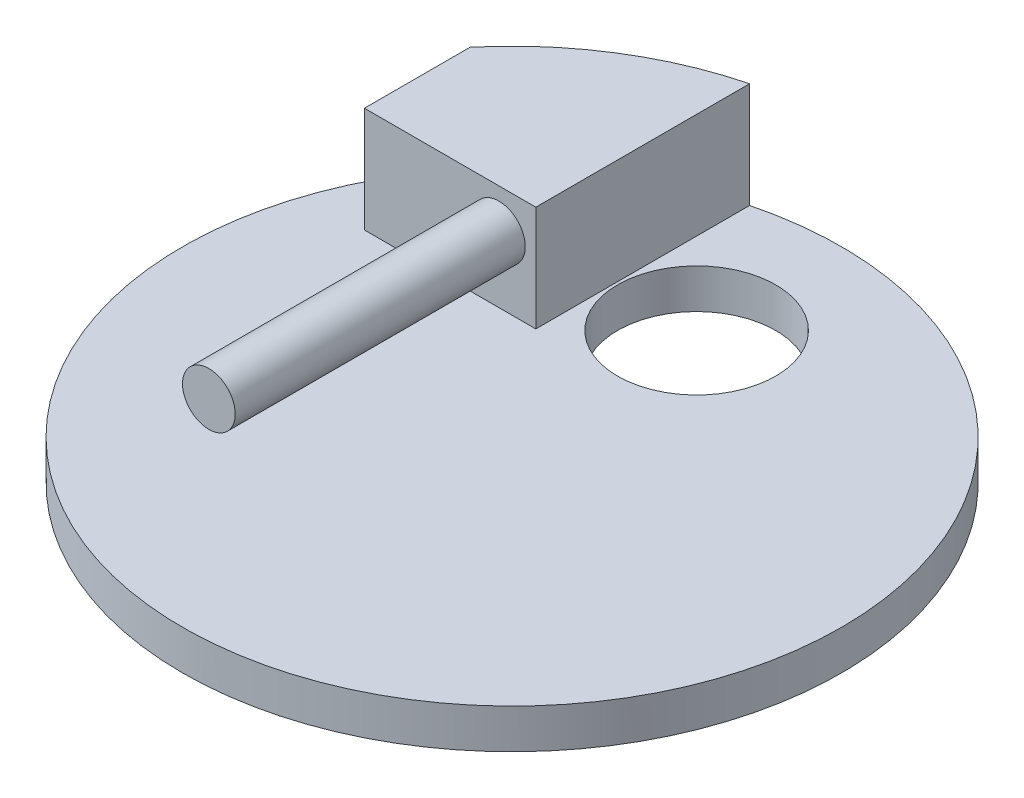
ISO-10303-21;
HEADER;
FILE_DESCRIPTION(('STEP AP214'),'2;1');
FILE_NAME('part.step','',(''),(''),'','','');
FILE_SCHEMA(('AUTOMOTIVE_DESIGN { 1 0 10303 214 1 1 1 1 }'));
ENDSEC;
DATA;
#1=APPLICATION_CONTEXT('core data for automotive mechanical design processes');
#2=APPLICATION_PROTOCOL_DEFINITION('international standard','automotive_design',2000,#1);
#3=PRODUCT_CONTEXT('',#1,'mechanical');
#4=PRODUCT('Part','Part','',(#3));
#5=PRODUCT_RELATED_PRODUCT_CATEGORY('part','',(#4));
#6=PRODUCT_DEFINITION_FORMATION('','',#4);
#7=PRODUCT_DEFINITION_CONTEXT('part definition',#1,'design');
#8=PRODUCT_DEFINITION('design','',#6,#7);
#9=PRODUCT_DEFINITION_SHAPE('','',#8);
#10=(LENGTH_UNIT() NAMED_UNIT(*) SI_UNIT(.MILLI.,.METRE.));
#11=(NAMED_UNIT(*) PLANE_ANGLE_UNIT() SI_UNIT($,.RADIAN.));
#12=(NAMED_UNIT(*) SI_UNIT($,.STERADIAN.) SOLID_ANGLE_UNIT());
#13=UNCERTAINTY_MEASURE_WITH_UNIT(LENGTH_MEASURE(1.E-05),#10,'distance_accuracy_value','');
#14=(GEOMETRIC_REPRESENTATION_CONTEXT(3) GLOBAL_UNCERTAINTY_ASSIGNED_CONTEXT((#13)) GLOBAL_UNIT_ASSIGNED_CONTEXT((#10,
#11,#12)) REPRESENTATION_CONTEXT('',''));
#15=CARTESIAN_POINT('',(0.,0.,0.));
#16=DIRECTION('',(0.,0.,1.));
#17=DIRECTION('',(1.,0.,0.));
#18=AXIS2_PLACEMENT_3D('',#15,#16,#17);
#19=CARTESIAN_POINT('',(0.,1.5,0.));
#20=DIRECTION('',(0.,1.,0.));
#21=DIRECTION('',(0.,0.,1.));
#22=AXIS2_PLACEMENT_3D('',#19,#20,#21);
#23=PLANE('',#22);
#24=CARTESIAN_POINT('',(0.,1.5,-7.));
#25=DIRECTION('',(0.,1.,0.));
#26=DIRECTION('',(0.,0.,1.));
#27=AXIS2_PLACEMENT_3D('',#24,#25,#26);
#28=CIRCLE('',#27,3.);
#29=CARTESIAN_POINT('',(0.,1.5,-4.));
#30=VERTEX_POINT('',#29);
#31=EDGE_CURVE('E108',#30,#30,#28,.T.);
#32=ORIENTED_EDGE('',*,*,#31,.F.);
#33=EDGE_LOOP('',(#32));
#34=FACE_BOUND('',#33,.T.);
#35=CARTESIAN_POINT('',(0.,1.5,0.));
#36=DIRECTION('',(0.,1.,0.));
#37=DIRECTION('',(0.,0.,1.));
#38=AXIS2_PLACEMENT_3D('',#35,#36,#37);
#39=CIRCLE('',#38,12.5);
#40=CARTESIAN_POINT('',(-9.6,1.5,-8.00562302385018));
#41=VERTEX_POINT('',#40);
#42=CARTESIAN_POINT('',(-3.1,1.5,-12.1095004025765));
#43=VERTEX_POINT('',#42);
#44=EDGE_CURVE('E45',#41,#43,#39,.T.);
#45=ORIENTED_EDGE('',*,*,#44,.T.);
#46=DIRECTION('',(0.,0.,1.));
#47=VECTOR('',#46,1.);
#48=CARTESIAN_POINT('',(-3.1,1.5,-12.501));
#49=LINE('',#48,#47);
#50=CARTESIAN_POINT('',(-3.1,1.5,-4.));
#51=VERTEX_POINT('',#50);
#52=EDGE_CURVE('E52',#43,#51,#49,.T.);
#53=ORIENTED_EDGE('',*,*,#52,.T.);
#54=DIRECTION('',(1.,0.,0.));
#55=VECTOR('',#54,1.);
#56=CARTESIAN_POINT('',(-9.6,1.5,-4.));
#57=LINE('',#56,#55);
#58=CARTESIAN_POINT('',(-9.6,1.5,-4.));
#59=VERTEX_POINT('',#58);
#60=EDGE_CURVE('E75',#59,#51,#57,.T.);
#61=ORIENTED_EDGE('',*,*,#60,.F.);
#62=DIRECTION('',(0.,0.,1.));
#63=VECTOR('',#62,1.);
#64=CARTESIAN_POINT('',(-9.6,1.5,-12.501));
#65=LINE('',#64,#63);
#66=EDGE_CURVE('E57',#41,#59,#65,.T.);
#67=ORIENTED_EDGE('',*,*,#66,.F.);
#68=EDGE_LOOP('',(#45,#53,#61,#67));
#69=FACE_BOUND('',#68,.T.);
#70=ADVANCED_FACE('F37',(#34,#69),#23,.T.);
#71=CARTESIAN_POINT('',(0.,0.,0.));
#72=DIRECTION('',(0.,1.,0.));
#73=DIRECTION('',(0.,0.,1.));
#74=AXIS2_PLACEMENT_3D('',#71,#72,#73);
#75=PLANE('',#74);
#76=CARTESIAN_POINT('',(0.,0.,0.));
#77=DIRECTION('',(0.,1.,0.));
#78=DIRECTION('',(0.,0.,1.));
#79=AXIS2_PLACEMENT_3D('',#76,#77,#78);
#80=CIRCLE('',#79,12.5);
#81=CARTESIAN_POINT('',(0.,0.,12.5));
#82=VERTEX_POINT('',#81);
#83=EDGE_CURVE('E111',#82,#82,#80,.T.);
#84=ORIENTED_EDGE('',*,*,#83,.F.);
#85=EDGE_LOOP('',(#84));
#86=FACE_BOUND('',#85,.T.);
#87=CARTESIAN_POINT('',(0.,0.,-7.));
#88=DIRECTION('',(0.,1.,0.));
#89=DIRECTION('',(0.,0.,1.));
#90=AXIS2_PLACEMENT_3D('',#87,#88,#89);
#91=CIRCLE('',#90,3.);
#92=CARTESIAN_POINT('',(0.,0.,-4.));
#93=VERTEX_POINT('',#92);
#94=EDGE_CURVE('E112',#93,#93,#91,.T.);
#95=ORIENTED_EDGE('',*,*,#94,.T.);
#96=EDGE_LOOP('',(#95));
#97=FACE_BOUND('',#96,.T.);
#98=ADVANCED_FACE('F119',(#86,#97),#75,.F.);
#99=CARTESIAN_POINT('',(0.,1.5,0.));
#100=DIRECTION('',(0.,-1.,0.));
#101=DIRECTION('',(0.,0.,-1.));
#102=AXIS2_PLACEMENT_3D('',#99,#100,#101);
#103=CYLINDRICAL_SURFACE('',#102,12.5);
#104=ORIENTED_EDGE('',*,*,#44,.F.);
#105=DIRECTION('',(0.,-1.,0.));
#106=VECTOR('',#105,1.);
#107=CARTESIAN_POINT('',(-9.6,1.5,-8.00562302385018));
#108=LINE('',#107,#106);
#109=CARTESIAN_POINT('',(-9.6,5.5,-8.00562302385018));
#110=VERTEX_POINT('',#109);
#111=EDGE_CURVE('E88',#41,#110,#108,.F.);
#112=ORIENTED_EDGE('',*,*,#111,.T.);
#113=CARTESIAN_POINT('',(0.,5.5,0.));
#114=DIRECTION('',(0.,1.,0.));
#115=DIRECTION('',(0.,0.,1.));
#116=AXIS2_PLACEMENT_3D('',#113,#114,#115);
#117=CIRCLE('',#116,12.5);
#118=CARTESIAN_POINT('',(-3.1,5.5,-12.1095004025765));
#119=VERTEX_POINT('',#118);
#120=EDGE_CURVE('E244',#110,#119,#117,.F.);
#121=ORIENTED_EDGE('',*,*,#120,.T.);
#122=DIRECTION('',(0.,-1.,0.));
#123=VECTOR('',#122,1.);
#124=CARTESIAN_POINT('',(-3.1,1.5,-12.1095004025765));
#125=LINE('',#124,#123);
#126=EDGE_CURVE('E104',#119,#43,#125,.T.);
#127=ORIENTED_EDGE('',*,*,#126,.T.);
#128=EDGE_LOOP('',(#104,#112,#121,#127));
#129=FACE_BOUND('',#128,.T.);
#130=ORIENTED_EDGE('',*,*,#83,.T.);
#131=EDGE_LOOP('',(#130));
#132=FACE_BOUND('',#131,.T.);
#133=ADVANCED_FACE('F39',(#129,#132),#103,.T.);
#134=CARTESIAN_POINT('',(0.,1.5,-7.));
#135=DIRECTION('',(0.,-1.,0.));
#136=DIRECTION('',(0.,0.,-1.));
#137=AXIS2_PLACEMENT_3D('',#134,#135,#136);
#138=CYLINDRICAL_SURFACE('',#137,3.);
#139=ORIENTED_EDGE('',*,*,#31,.T.);
#140=EDGE_LOOP('',(#139));
#141=FACE_BOUND('',#140,.T.);
#142=ORIENTED_EDGE('',*,*,#94,.F.);
#143=EDGE_LOOP('',(#142));
#144=FACE_BOUND('',#143,.T.);
#145=ADVANCED_FACE('F124',(#141,#144),#138,.F.);
#146=CARTESIAN_POINT('',(-9.6,1.5,-12.501));
#147=DIRECTION('',(-1.,0.,0.));
#148=DIRECTION('',(0.,0.,1.));
#149=AXIS2_PLACEMENT_3D('',#146,#147,#148);
#150=PLANE('',#149);
#151=ORIENTED_EDGE('',*,*,#111,.F.);
#152=ORIENTED_EDGE('',*,*,#66,.T.);
#153=DIRECTION('',(0.,-1.,0.));
#154=VECTOR('',#153,1.);
#155=CARTESIAN_POINT('',(-9.6,1.5,-4.));
#156=LINE('',#155,#154);
#157=CARTESIAN_POINT('',(-9.6,5.5,-4.));
#158=VERTEX_POINT('',#157);
#159=EDGE_CURVE('E80',#158,#59,#156,.T.);
#160=ORIENTED_EDGE('',*,*,#159,.F.);
#161=DIRECTION('',(0.,0.,1.));
#162=VECTOR('',#161,1.);
#163=CARTESIAN_POINT('',(-9.6,5.5,-12.501));
#164=LINE('',#163,#162);
#165=EDGE_CURVE('E102',#110,#158,#164,.T.);
#166=ORIENTED_EDGE('',*,*,#165,.F.);
#167=EDGE_LOOP('',(#151,#152,#160,#166));
#168=FACE_BOUND('',#167,.T.);
#169=ADVANCED_FACE('F85',(#168),#150,.T.);
#170=CARTESIAN_POINT('',(-9.6,5.5,-12.501));
#171=DIRECTION('',(0.,1.,0.));
#172=DIRECTION('',(0.,0.,1.));
#173=AXIS2_PLACEMENT_3D('',#170,#171,#172);
#174=PLANE('',#173);
#175=ORIENTED_EDGE('',*,*,#120,.F.);
#176=ORIENTED_EDGE('',*,*,#165,.T.);
#177=DIRECTION('',(-1.,0.,0.));
#178=VECTOR('',#177,1.);
#179=CARTESIAN_POINT('',(-9.6,5.5,-4.));
#180=LINE('',#179,#178);
#181=CARTESIAN_POINT('',(-3.1,5.5,-4.));
#182=VERTEX_POINT('',#181);
#183=EDGE_CURVE('E89',#182,#158,#180,.T.);
#184=ORIENTED_EDGE('',*,*,#183,.F.);
#185=DIRECTION('',(0.,0.,1.));
#186=VECTOR('',#185,1.);
#187=CARTESIAN_POINT('',(-3.1,5.5,-12.501));
#188=LINE('',#187,#186);
#189=EDGE_CURVE('E105',#119,#182,#188,.T.);
#190=ORIENTED_EDGE('',*,*,#189,.F.);
#191=EDGE_LOOP('',(#175,#176,#184,#190));
#192=FACE_BOUND('',#191,.T.);
#193=ADVANCED_FACE('F132',(#192),#174,.T.);
#194=CARTESIAN_POINT('',(-3.1,1.5,-12.501));
#195=DIRECTION('',(1.,0.,0.));
#196=DIRECTION('',(0.,0.,-1.));
#197=AXIS2_PLACEMENT_3D('',#194,#195,#196);
#198=PLANE('',#197);
#199=ORIENTED_EDGE('',*,*,#126,.F.);
#200=ORIENTED_EDGE('',*,*,#189,.T.);
#201=DIRECTION('',(0.,1.,0.));
#202=VECTOR('',#201,1.);
#203=CARTESIAN_POINT('',(-3.1,1.5,-4.));
#204=LINE('',#203,#202);
#205=EDGE_CURVE('E79',#51,#182,#204,.T.);
#206=ORIENTED_EDGE('',*,*,#205,.F.);
#207=ORIENTED_EDGE('',*,*,#52,.F.);
#208=EDGE_LOOP('',(#199,#200,#206,#207));
#209=FACE_BOUND('',#208,.T.);
#210=ADVANCED_FACE('F167',(#209),#198,.T.);
#211=CARTESIAN_POINT('',(0.,0.,-4.));
#212=DIRECTION('',(0.,0.,-1.));
#213=DIRECTION('',(-1.,0.,0.));
#214=AXIS2_PLACEMENT_3D('',#211,#212,#213);
#215=PLANE('',#214);
#216=CARTESIAN_POINT('',(-4.5,4.,-4.));
#217=DIRECTION('',(0.,0.,-1.));
#218=DIRECTION('',(-1.,0.,0.));
#219=AXIS2_PLACEMENT_3D('',#216,#217,#218);
#220=CIRCLE('',#219,1.);
#221=CARTESIAN_POINT('',(-5.5,4.,-4.));
#222=VERTEX_POINT('',#221);
#223=EDGE_CURVE('E11',#222,#222,#220,.F.);
#224=ORIENTED_EDGE('',*,*,#223,.F.);
#225=EDGE_LOOP('',(#224));
#226=FACE_BOUND('',#225,.T.);
#227=ORIENTED_EDGE('',*,*,#159,.T.);
#228=ORIENTED_EDGE('',*,*,#60,.T.);
#229=ORIENTED_EDGE('',*,*,#205,.T.);
#230=ORIENTED_EDGE('',*,*,#183,.T.);
#231=EDGE_LOOP('',(#227,#228,#229,#230));
#232=FACE_BOUND('',#231,.T.);
#233=ADVANCED_FACE('F91',(#226,#232),#215,.F.);
#234=CARTESIAN_POINT('',(-4.5,4.,7.));
#235=DIRECTION('',(0.,0.,-1.));
#236=DIRECTION('',(-1.,0.,0.));
#237=AXIS2_PLACEMENT_3D('',#234,#235,#236);
#238=CYLINDRICAL_SURFACE('',#237,1.);
#239=CARTESIAN_POINT('',(-4.5,4.,7.));
#240=DIRECTION('',(0.,0.,1.));
#241=DIRECTION('',(1.,0.,0.));
#242=AXIS2_PLACEMENT_3D('',#239,#240,#241);
#243=CIRCLE('',#242,1.);
#244=CARTESIAN_POINT('',(-3.5,4.,7.));
#245=VERTEX_POINT('',#244);
#246=EDGE_CURVE('E93',#245,#245,#243,.T.);
#247=ORIENTED_EDGE('',*,*,#246,.F.);
#248=EDGE_LOOP('',(#247));
#249=FACE_BOUND('',#248,.T.);
#250=ORIENTED_EDGE('',*,*,#223,.T.);
#251=EDGE_LOOP('',(#250));
#252=FACE_BOUND('',#251,.T.);
#253=ADVANCED_FACE('F188',(#249,#252),#238,.T.);
#254=CARTESIAN_POINT('',(-4.5,4.,7.));
#255=DIRECTION('',(0.,0.,1.));
#256=DIRECTION('',(1.,0.,0.));
#257=AXIS2_PLACEMENT_3D('',#254,#255,#256);
#258=PLANE('',#257);
#259=ORIENTED_EDGE('',*,*,#246,.T.);
#260=EDGE_LOOP('',(#259));
#261=FACE_BOUND('',#260,.T.);
#262=ADVANCED_FACE('F199',(#261),#258,.T.);
#263=CLOSED_SHELL('',(#70,#98,#133,#145,#169,#193,#210,#233,#253,#262));
#264=MANIFOLD_SOLID_BREP('B2',#263);
#265=ADVANCED_BREP_SHAPE_REPRESENTATION('',(#18,#264),#14);
#266=SHAPE_DEFINITION_REPRESENTATION(#9,#265);
ENDSEC;
END-ISO-10303-21;
